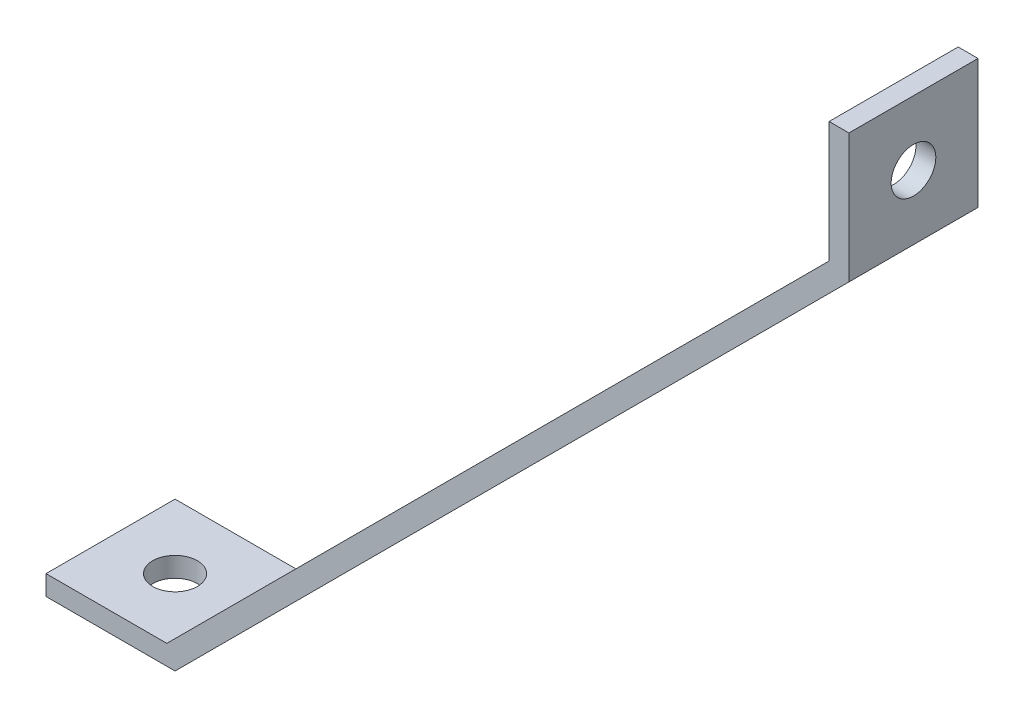
ISO-10303-21;
HEADER;
FILE_DESCRIPTION(('STEP AP214'),'2;1');
FILE_NAME('part.step','',(''),(''),'','','');
FILE_SCHEMA(('AUTOMOTIVE_DESIGN { 1 0 10303 214 1 1 1 1 }'));
ENDSEC;
DATA;
#1=APPLICATION_CONTEXT('core data for automotive mechanical design processes');
#2=APPLICATION_PROTOCOL_DEFINITION('international standard','automotive_design',2000,#1);
#3=PRODUCT_CONTEXT('',#1,'mechanical');
#4=PRODUCT('Part','Part','',(#3));
#5=PRODUCT_RELATED_PRODUCT_CATEGORY('part','',(#4));
#6=PRODUCT_DEFINITION_FORMATION('','',#4);
#7=PRODUCT_DEFINITION_CONTEXT('part definition',#1,'design');
#8=PRODUCT_DEFINITION('design','',#6,#7);
#9=PRODUCT_DEFINITION_SHAPE('','',#8);
#10=(LENGTH_UNIT() NAMED_UNIT(*) SI_UNIT(.MILLI.,.METRE.));
#11=(NAMED_UNIT(*) PLANE_ANGLE_UNIT() SI_UNIT($,.RADIAN.));
#12=(NAMED_UNIT(*) SI_UNIT($,.STERADIAN.) SOLID_ANGLE_UNIT());
#13=UNCERTAINTY_MEASURE_WITH_UNIT(LENGTH_MEASURE(1.E-05),#10,'distance_accuracy_value','');
#14=(GEOMETRIC_REPRESENTATION_CONTEXT(3) GLOBAL_UNCERTAINTY_ASSIGNED_CONTEXT((#13)) GLOBAL_UNIT_ASSIGNED_CONTEXT((#10,
#11,#12)) REPRESENTATION_CONTEXT('',''));
#15=CARTESIAN_POINT('',(0.,0.,0.));
#16=DIRECTION('',(0.,0.,1.));
#17=DIRECTION('',(1.,0.,0.));
#18=AXIS2_PLACEMENT_3D('',#15,#16,#17);
#19=CARTESIAN_POINT('',(107.76307345283,107.76307345283,20.6375));
#20=DIRECTION('',(-1.,0.,0.));
#21=DIRECTION('',(0.,0.,1.));
#22=AXIS2_PLACEMENT_3D('',#19,#20,#21);
#23=PLANE('',#22);
#24=CARTESIAN_POINT('',(107.76307345283,128.40057345283,0.));
#25=DIRECTION('',(-1.,0.,0.));
#26=DIRECTION('',(0.,-1.,0.));
#27=AXIS2_PLACEMENT_3D('',#24,#25,#26);
#28=CIRCLE('',#27,7.14374999999999);
#29=CARTESIAN_POINT('',(107.76307345283,121.25682345283,0.));
#30=VERTEX_POINT('',#29);
#31=EDGE_CURVE('E213',#30,#30,#28,.T.);
#32=ORIENTED_EDGE('',*,*,#31,.T.);
#33=EDGE_LOOP('',(#32));
#34=FACE_BOUND('',#33,.T.);
#35=DIRECTION('',(0.,1.,0.));
#36=VECTOR('',#35,1.);
#37=CARTESIAN_POINT('',(107.76307345283,107.76307345283,-20.6375));
#38=LINE('',#37,#36);
#39=CARTESIAN_POINT('',(107.76307345283,107.76307345283,-20.6375));
#40=VERTEX_POINT('',#39);
#41=CARTESIAN_POINT('',(107.76307345283,149.03807345283,-20.6375));
#42=VERTEX_POINT('',#41);
#43=EDGE_CURVE('E143',#40,#42,#38,.T.);
#44=ORIENTED_EDGE('',*,*,#43,.T.);
#45=DIRECTION('',(0.,0.,-1.));
#46=VECTOR('',#45,1.);
#47=CARTESIAN_POINT('',(107.76307345283,149.03807345283,20.6375));
#48=LINE('',#47,#46);
#49=CARTESIAN_POINT('',(107.76307345283,149.03807345283,20.6375));
#50=VERTEX_POINT('',#49);
#51=EDGE_CURVE('E11',#50,#42,#48,.T.);
#52=ORIENTED_EDGE('',*,*,#51,.F.);
#53=DIRECTION('',(0.,1.,0.));
#54=VECTOR('',#53,1.);
#55=CARTESIAN_POINT('',(107.76307345283,107.76307345283,20.6375));
#56=LINE('',#55,#54);
#57=CARTESIAN_POINT('',(107.76307345283,107.76307345283,20.6375));
#58=VERTEX_POINT('',#57);
#59=EDGE_CURVE('E96',#58,#50,#56,.T.);
#60=ORIENTED_EDGE('',*,*,#59,.F.);
#61=DIRECTION('',(0.,0.,-1.));
#62=VECTOR('',#61,1.);
#63=CARTESIAN_POINT('',(107.76307345283,107.76307345283,20.6375));
#64=LINE('',#63,#62);
#65=EDGE_CURVE('E142',#58,#40,#64,.T.);
#66=ORIENTED_EDGE('',*,*,#65,.T.);
#67=EDGE_LOOP('',(#44,#52,#60,#66));
#68=FACE_BOUND('',#67,.T.);
#69=ADVANCED_FACE('F40',(#34,#68),#23,.F.);
#70=CARTESIAN_POINT('',(101.41307345283,149.03807345283,20.6375));
#71=DIRECTION('',(0.,1.,0.));
#72=DIRECTION('',(0.,0.,1.));
#73=AXIS2_PLACEMENT_3D('',#70,#71,#72);
#74=PLANE('',#73);
#75=DIRECTION('',(1.,0.,0.));
#76=VECTOR('',#75,1.);
#77=CARTESIAN_POINT('',(101.41307345283,149.03807345283,-20.6375));
#78=LINE('',#77,#76);
#79=CARTESIAN_POINT('',(101.41307345283,149.03807345283,-20.6375));
#80=VERTEX_POINT('',#79);
#81=EDGE_CURVE('E147',#80,#42,#78,.T.);
#82=ORIENTED_EDGE('',*,*,#81,.F.);
#83=DIRECTION('',(0.,0.,-1.));
#84=VECTOR('',#83,1.);
#85=CARTESIAN_POINT('',(101.41307345283,149.03807345283,20.6375));
#86=LINE('',#85,#84);
#87=CARTESIAN_POINT('',(101.41307345283,149.03807345283,20.6375));
#88=VERTEX_POINT('',#87);
#89=EDGE_CURVE('E49',#88,#80,#86,.T.);
#90=ORIENTED_EDGE('',*,*,#89,.F.);
#91=DIRECTION('',(1.,0.,0.));
#92=VECTOR('',#91,1.);
#93=CARTESIAN_POINT('',(101.41307345283,149.03807345283,20.6375));
#94=LINE('',#93,#92);
#95=EDGE_CURVE('E200',#88,#50,#94,.T.);
#96=ORIENTED_EDGE('',*,*,#95,.T.);
#97=ORIENTED_EDGE('',*,*,#51,.T.);
#98=EDGE_LOOP('',(#82,#90,#96,#97));
#99=FACE_BOUND('',#98,.T.);
#100=ADVANCED_FACE('F191',(#99),#74,.T.);
#101=CARTESIAN_POINT('',(101.41307345283,107.76307345283,20.6375));
#102=DIRECTION('',(-1.,0.,0.));
#103=DIRECTION('',(0.,0.,1.));
#104=AXIS2_PLACEMENT_3D('',#101,#102,#103);
#105=PLANE('',#104);
#106=CARTESIAN_POINT('',(101.41307345283,128.40057345283,0.));
#107=DIRECTION('',(-1.,0.,0.));
#108=DIRECTION('',(0.,-1.,0.));
#109=AXIS2_PLACEMENT_3D('',#106,#107,#108);
#110=CIRCLE('',#109,7.14374999999999);
#111=CARTESIAN_POINT('',(101.41307345283,121.25682345283,0.));
#112=VERTEX_POINT('',#111);
#113=EDGE_CURVE('E217',#112,#112,#110,.T.);
#114=ORIENTED_EDGE('',*,*,#113,.F.);
#115=EDGE_LOOP('',(#114));
#116=FACE_BOUND('',#115,.T.);
#117=DIRECTION('',(0.,1.,0.));
#118=VECTOR('',#117,1.);
#119=CARTESIAN_POINT('',(101.41307345283,107.76307345283,-20.6375));
#120=LINE('',#119,#118);
#121=CARTESIAN_POINT('',(101.41307345283,110.393329573899,-20.6375));
#122=VERTEX_POINT('',#121);
#123=EDGE_CURVE('E152',#122,#80,#120,.T.);
#124=ORIENTED_EDGE('',*,*,#123,.F.);
#125=DIRECTION('',(0.,0.,-1.));
#126=VECTOR('',#125,1.);
#127=CARTESIAN_POINT('',(101.41307345283,110.393329573899,20.6375));
#128=LINE('',#127,#126);
#129=CARTESIAN_POINT('',(101.41307345283,110.393329573899,20.6375));
#130=VERTEX_POINT('',#129);
#131=EDGE_CURVE('E179',#130,#122,#128,.T.);
#132=ORIENTED_EDGE('',*,*,#131,.F.);
#133=DIRECTION('',(0.,1.,0.));
#134=VECTOR('',#133,1.);
#135=CARTESIAN_POINT('',(101.41307345283,107.76307345283,20.6375));
#136=LINE('',#135,#134);
#137=EDGE_CURVE('E188',#130,#88,#136,.T.);
#138=ORIENTED_EDGE('',*,*,#137,.T.);
#139=ORIENTED_EDGE('',*,*,#89,.T.);
#140=EDGE_LOOP('',(#124,#132,#138,#139));
#141=FACE_BOUND('',#140,.T.);
#142=ADVANCED_FACE('F186',(#116,#141),#105,.T.);
#143=CARTESIAN_POINT('',(-112.253201513364,-103.272945392295,20.6375));
#144=DIRECTION('',(-0.707106781186549,0.707106781186546,0.));
#145=DIRECTION('',(-0.707106781186546,-0.707106781186549,0.));
#146=AXIS2_PLACEMENT_3D('',#143,#144,#145);
#147=PLANE('',#146);
#148=DIRECTION('',(0.707106781186546,0.707106781186549,0.));
#149=VECTOR('',#148,1.);
#150=CARTESIAN_POINT('',(-112.253201513364,-103.272945392295,-20.6375));
#151=LINE('',#150,#149);
#152=CARTESIAN_POINT('',(-110.393329573899,-101.41307345283,-20.6375));
#153=VERTEX_POINT('',#152);
#154=EDGE_CURVE('E156',#153,#122,#151,.T.);
#155=ORIENTED_EDGE('',*,*,#154,.F.);
#156=DIRECTION('',(0.,0.,-1.));
#157=VECTOR('',#156,1.);
#158=CARTESIAN_POINT('',(-110.393329573899,-101.41307345283,20.6375));
#159=LINE('',#158,#157);
#160=CARTESIAN_POINT('',(-110.393329573899,-101.41307345283,20.6375));
#161=VERTEX_POINT('',#160);
#162=EDGE_CURVE('E176',#161,#153,#159,.T.);
#163=ORIENTED_EDGE('',*,*,#162,.F.);
#164=DIRECTION('',(0.707106781186546,0.707106781186549,0.));
#165=VECTOR('',#164,1.);
#166=CARTESIAN_POINT('',(-112.253201513364,-103.272945392295,20.6375));
#167=LINE('',#166,#165);
#168=EDGE_CURVE('E136',#161,#130,#167,.T.);
#169=ORIENTED_EDGE('',*,*,#168,.T.);
#170=ORIENTED_EDGE('',*,*,#131,.T.);
#171=EDGE_LOOP('',(#155,#163,#169,#170));
#172=FACE_BOUND('',#171,.T.);
#173=ADVANCED_FACE('F198',(#172),#147,.T.);
#174=CARTESIAN_POINT('',(-149.03807345283,-101.41307345283,20.6375));
#175=DIRECTION('',(0.,1.,0.));
#176=DIRECTION('',(-1.,0.,0.));
#177=AXIS2_PLACEMENT_3D('',#174,#175,#176);
#178=PLANE('',#177);
#179=CARTESIAN_POINT('',(-128.40057345283,-101.41307345283,0.));
#180=DIRECTION('',(0.,1.,0.));
#181=DIRECTION('',(0.,0.,1.));
#182=AXIS2_PLACEMENT_3D('',#179,#180,#181);
#183=CIRCLE('',#182,7.14375);
#184=CARTESIAN_POINT('',(-128.40057345283,-101.41307345283,7.14375));
#185=VERTEX_POINT('',#184);
#186=EDGE_CURVE('E209',#185,#185,#183,.T.);
#187=ORIENTED_EDGE('',*,*,#186,.F.);
#188=EDGE_LOOP('',(#187));
#189=FACE_BOUND('',#188,.T.);
#190=DIRECTION('',(1.,0.,0.));
#191=VECTOR('',#190,1.);
#192=CARTESIAN_POINT('',(-149.03807345283,-101.41307345283,-20.6375));
#193=LINE('',#192,#191);
#194=CARTESIAN_POINT('',(-149.03807345283,-101.41307345283,-20.6375));
#195=VERTEX_POINT('',#194);
#196=EDGE_CURVE('E160',#195,#153,#193,.T.);
#197=ORIENTED_EDGE('',*,*,#196,.F.);
#198=DIRECTION('',(0.,0.,-1.));
#199=VECTOR('',#198,1.);
#200=CARTESIAN_POINT('',(-149.03807345283,-101.41307345283,20.6375));
#201=LINE('',#200,#199);
#202=CARTESIAN_POINT('',(-149.03807345283,-101.41307345283,20.6375));
#203=VERTEX_POINT('',#202);
#204=EDGE_CURVE('E121',#203,#195,#201,.T.);
#205=ORIENTED_EDGE('',*,*,#204,.F.);
#206=DIRECTION('',(1.,0.,0.));
#207=VECTOR('',#206,1.);
#208=CARTESIAN_POINT('',(-149.03807345283,-101.41307345283,20.6375));
#209=LINE('',#208,#207);
#210=EDGE_CURVE('E132',#203,#161,#209,.T.);
#211=ORIENTED_EDGE('',*,*,#210,.T.);
#212=ORIENTED_EDGE('',*,*,#162,.T.);
#213=EDGE_LOOP('',(#197,#205,#211,#212));
#214=FACE_BOUND('',#213,.T.);
#215=ADVANCED_FACE('F240',(#189,#214),#178,.T.);
#216=CARTESIAN_POINT('',(-149.03807345283,-107.76307345283,20.6375));
#217=DIRECTION('',(-1.,0.,0.));
#218=DIRECTION('',(0.,0.,1.));
#219=AXIS2_PLACEMENT_3D('',#216,#217,#218);
#220=PLANE('',#219);
#221=DIRECTION('',(0.,1.,0.));
#222=VECTOR('',#221,1.);
#223=CARTESIAN_POINT('',(-149.03807345283,-107.76307345283,-20.6375));
#224=LINE('',#223,#222);
#225=CARTESIAN_POINT('',(-149.03807345283,-107.76307345283,-20.6375));
#226=VERTEX_POINT('',#225);
#227=EDGE_CURVE('E119',#226,#195,#224,.T.);
#228=ORIENTED_EDGE('',*,*,#227,.F.);
#229=DIRECTION('',(0.,0.,-1.));
#230=VECTOR('',#229,1.);
#231=CARTESIAN_POINT('',(-149.03807345283,-107.76307345283,20.6375));
#232=LINE('',#231,#230);
#233=CARTESIAN_POINT('',(-149.03807345283,-107.76307345283,20.6375));
#234=VERTEX_POINT('',#233);
#235=EDGE_CURVE('E113',#234,#226,#232,.T.);
#236=ORIENTED_EDGE('',*,*,#235,.F.);
#237=DIRECTION('',(0.,1.,0.));
#238=VECTOR('',#237,1.);
#239=CARTESIAN_POINT('',(-149.03807345283,-107.76307345283,20.6375));
#240=LINE('',#239,#238);
#241=EDGE_CURVE('E117',#234,#203,#240,.T.);
#242=ORIENTED_EDGE('',*,*,#241,.T.);
#243=ORIENTED_EDGE('',*,*,#204,.T.);
#244=EDGE_LOOP('',(#228,#236,#242,#243));
#245=FACE_BOUND('',#244,.T.);
#246=ADVANCED_FACE('F115',(#245),#220,.T.);
#247=CARTESIAN_POINT('',(-149.03807345283,-107.76307345283,20.6375));
#248=DIRECTION('',(0.,1.,0.));
#249=DIRECTION('',(-1.,0.,0.));
#250=AXIS2_PLACEMENT_3D('',#247,#248,#249);
#251=PLANE('',#250);
#252=CARTESIAN_POINT('',(-128.40057345283,-107.76307345283,0.));
#253=DIRECTION('',(0.,1.,0.));
#254=DIRECTION('',(0.,0.,1.));
#255=AXIS2_PLACEMENT_3D('',#252,#253,#254);
#256=CIRCLE('',#255,7.14375);
#257=CARTESIAN_POINT('',(-128.40057345283,-107.76307345283,7.14375));
#258=VERTEX_POINT('',#257);
#259=EDGE_CURVE('E148',#258,#258,#256,.T.);
#260=ORIENTED_EDGE('',*,*,#259,.T.);
#261=EDGE_LOOP('',(#260));
#262=FACE_BOUND('',#261,.T.);
#263=DIRECTION('',(1.,0.,0.));
#264=VECTOR('',#263,1.);
#265=CARTESIAN_POINT('',(-149.03807345283,-107.76307345283,-20.6375));
#266=LINE('',#265,#264);
#267=CARTESIAN_POINT('',(-107.76307345283,-107.76307345283,-20.6375));
#268=VERTEX_POINT('',#267);
#269=EDGE_CURVE('E84',#226,#268,#266,.T.);
#270=ORIENTED_EDGE('',*,*,#269,.T.);
#271=DIRECTION('',(0.,0.,-1.));
#272=VECTOR('',#271,1.);
#273=CARTESIAN_POINT('',(-107.76307345283,-107.76307345283,20.6375));
#274=LINE('',#273,#272);
#275=CARTESIAN_POINT('',(-107.76307345283,-107.76307345283,20.6375));
#276=VERTEX_POINT('',#275);
#277=EDGE_CURVE('E122',#276,#268,#274,.T.);
#278=ORIENTED_EDGE('',*,*,#277,.F.);
#279=DIRECTION('',(1.,0.,0.));
#280=VECTOR('',#279,1.);
#281=CARTESIAN_POINT('',(-149.03807345283,-107.76307345283,20.6375));
#282=LINE('',#281,#280);
#283=EDGE_CURVE('E124',#234,#276,#282,.T.);
#284=ORIENTED_EDGE('',*,*,#283,.F.);
#285=ORIENTED_EDGE('',*,*,#235,.T.);
#286=EDGE_LOOP('',(#270,#278,#284,#285));
#287=FACE_BOUND('',#286,.T.);
#288=ADVANCED_FACE('F125',(#262,#287),#251,.F.);
#289=CARTESIAN_POINT('',(-107.76307345283,-107.76307345283,20.6375));
#290=DIRECTION('',(-0.707106781186549,0.707106781186546,0.));
#291=DIRECTION('',(-0.707106781186546,-0.707106781186549,0.));
#292=AXIS2_PLACEMENT_3D('',#289,#290,#291);
#293=PLANE('',#292);
#294=DIRECTION('',(0.707106781186546,0.707106781186549,0.));
#295=VECTOR('',#294,1.);
#296=CARTESIAN_POINT('',(-107.76307345283,-107.76307345283,-20.6375));
#297=LINE('',#296,#295);
#298=EDGE_CURVE('E90',#268,#40,#297,.T.);
#299=ORIENTED_EDGE('',*,*,#298,.T.);
#300=ORIENTED_EDGE('',*,*,#65,.F.);
#301=DIRECTION('',(0.707106781186546,0.707106781186549,0.));
#302=VECTOR('',#301,1.);
#303=CARTESIAN_POINT('',(-107.76307345283,-107.76307345283,20.6375));
#304=LINE('',#303,#302);
#305=EDGE_CURVE('E57',#276,#58,#304,.T.);
#306=ORIENTED_EDGE('',*,*,#305,.F.);
#307=ORIENTED_EDGE('',*,*,#277,.T.);
#308=EDGE_LOOP('',(#299,#300,#306,#307));
#309=FACE_BOUND('',#308,.T.);
#310=ADVANCED_FACE('F274',(#309),#293,.F.);
#311=CARTESIAN_POINT('',(107.76307345283,149.03807345283,20.6375));
#312=DIRECTION('',(0.,0.,-1.));
#313=DIRECTION('',(-1.,0.,0.));
#314=AXIS2_PLACEMENT_3D('',#311,#312,#313);
#315=PLANE('',#314);
#316=ORIENTED_EDGE('',*,*,#59,.T.);
#317=ORIENTED_EDGE('',*,*,#95,.F.);
#318=ORIENTED_EDGE('',*,*,#137,.F.);
#319=ORIENTED_EDGE('',*,*,#168,.F.);
#320=ORIENTED_EDGE('',*,*,#210,.F.);
#321=ORIENTED_EDGE('',*,*,#241,.F.);
#322=ORIENTED_EDGE('',*,*,#283,.T.);
#323=ORIENTED_EDGE('',*,*,#305,.T.);
#324=EDGE_LOOP('',(#316,#317,#318,#319,#320,#321,#322,#323));
#325=FACE_BOUND('',#324,.T.);
#326=ADVANCED_FACE('F129',(#325),#315,.F.);
#327=CARTESIAN_POINT('',(107.76307345283,149.03807345283,-20.6375));
#328=DIRECTION('',(0.,0.,-1.));
#329=DIRECTION('',(-1.,0.,0.));
#330=AXIS2_PLACEMENT_3D('',#327,#328,#329);
#331=PLANE('',#330);
#332=ORIENTED_EDGE('',*,*,#43,.F.);
#333=ORIENTED_EDGE('',*,*,#298,.F.);
#334=ORIENTED_EDGE('',*,*,#269,.F.);
#335=ORIENTED_EDGE('',*,*,#227,.T.);
#336=ORIENTED_EDGE('',*,*,#196,.T.);
#337=ORIENTED_EDGE('',*,*,#154,.T.);
#338=ORIENTED_EDGE('',*,*,#123,.T.);
#339=ORIENTED_EDGE('',*,*,#81,.T.);
#340=EDGE_LOOP('',(#332,#333,#334,#335,#336,#337,#338,#339));
#341=FACE_BOUND('',#340,.T.);
#342=ADVANCED_FACE('F194',(#341),#331,.T.);
#343=CARTESIAN_POINT('',(-128.40057345283,-107.76307345283,0.));
#344=DIRECTION('',(0.,1.,0.));
#345=DIRECTION('',(0.,0.,1.));
#346=AXIS2_PLACEMENT_3D('',#343,#344,#345);
#347=CYLINDRICAL_SURFACE('',#346,7.14375);
#348=ORIENTED_EDGE('',*,*,#259,.F.);
#349=EDGE_LOOP('',(#348));
#350=FACE_BOUND('',#349,.T.);
#351=ORIENTED_EDGE('',*,*,#186,.T.);
#352=EDGE_LOOP('',(#351));
#353=FACE_BOUND('',#352,.T.);
#354=ADVANCED_FACE('F230',(#350,#353),#347,.F.);
#355=CARTESIAN_POINT('',(107.76307345283,128.40057345283,0.));
#356=DIRECTION('',(-1.,0.,0.));
#357=DIRECTION('',(0.,-1.,0.));
#358=AXIS2_PLACEMENT_3D('',#355,#356,#357);
#359=CYLINDRICAL_SURFACE('',#358,7.14374999999999);
#360=ORIENTED_EDGE('',*,*,#31,.F.);
#361=EDGE_LOOP('',(#360));
#362=FACE_BOUND('',#361,.T.);
#363=ORIENTED_EDGE('',*,*,#113,.T.);
#364=EDGE_LOOP('',(#363));
#365=FACE_BOUND('',#364,.T.);
#366=ADVANCED_FACE('F227',(#362,#365),#359,.F.);
#367=CLOSED_SHELL('',(#69,#100,#142,#173,#215,#246,#288,#310,#326,#342,#354,#366));
#368=MANIFOLD_SOLID_BREP('B2',#367);
#369=ADVANCED_BREP_SHAPE_REPRESENTATION('',(#18,#368),#14);
#370=SHAPE_DEFINITION_REPRESENTATION(#9,#369);
ENDSEC;
END-ISO-10303-21;
